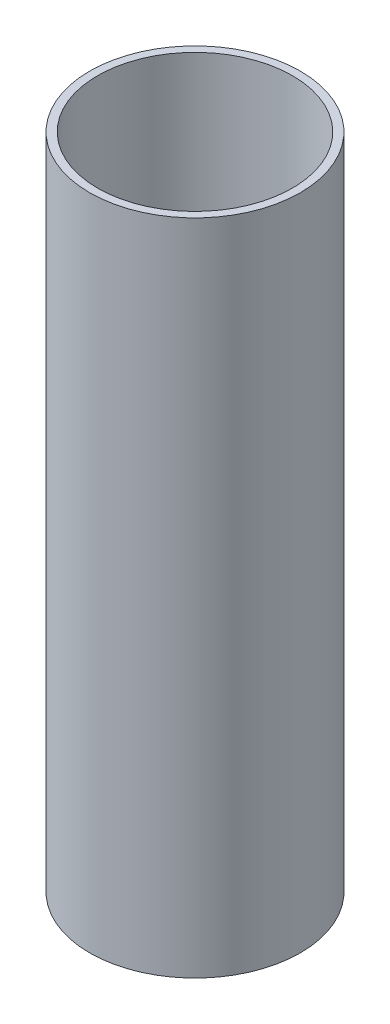
ISO-10303-21;
HEADER;
FILE_DESCRIPTION(('STEP AP214'),'2;1');
FILE_NAME('part.step','',(''),(''),'','','');
FILE_SCHEMA(('AUTOMOTIVE_DESIGN { 1 0 10303 214 1 1 1 1 }'));
ENDSEC;
DATA;
#1=APPLICATION_CONTEXT('core data for automotive mechanical design processes');
#2=APPLICATION_PROTOCOL_DEFINITION('international standard','automotive_design',2000,#1);
#3=PRODUCT_CONTEXT('',#1,'mechanical');
#4=PRODUCT('Part','Part','',(#3));
#5=PRODUCT_RELATED_PRODUCT_CATEGORY('part','',(#4));
#6=PRODUCT_DEFINITION_FORMATION('','',#4);
#7=PRODUCT_DEFINITION_CONTEXT('part definition',#1,'design');
#8=PRODUCT_DEFINITION('design','',#6,#7);
#9=PRODUCT_DEFINITION_SHAPE('','',#8);
#10=(LENGTH_UNIT() NAMED_UNIT(*) SI_UNIT(.MILLI.,.METRE.));
#11=(NAMED_UNIT(*) PLANE_ANGLE_UNIT() SI_UNIT($,.RADIAN.));
#12=(NAMED_UNIT(*) SI_UNIT($,.STERADIAN.) SOLID_ANGLE_UNIT());
#13=UNCERTAINTY_MEASURE_WITH_UNIT(LENGTH_MEASURE(1.E-05),#10,'distance_accuracy_value','');
#14=(GEOMETRIC_REPRESENTATION_CONTEXT(3) GLOBAL_UNCERTAINTY_ASSIGNED_CONTEXT((#13)) GLOBAL_UNIT_ASSIGNED_CONTEXT((#10,
#11,#12)) REPRESENTATION_CONTEXT('',''));
#15=CARTESIAN_POINT('',(0.,0.,0.));
#16=DIRECTION('',(0.,0.,1.));
#17=DIRECTION('',(1.,0.,0.));
#18=AXIS2_PLACEMENT_3D('',#15,#16,#17);
#19=CARTESIAN_POINT('',(0.,100.,0.));
#20=DIRECTION('',(0.,1.,0.));
#21=DIRECTION('',(0.,0.,1.));
#22=AXIS2_PLACEMENT_3D('',#19,#20,#21);
#23=PLANE('',#22);
#24=CARTESIAN_POINT('',(0.,100.,0.));
#25=DIRECTION('',(0.,1.,0.));
#26=DIRECTION('',(0.,0.,1.));
#27=AXIS2_PLACEMENT_3D('',#24,#25,#26);
#28=CIRCLE('',#27,16.);
#29=CARTESIAN_POINT('',(0.,100.,16.));
#30=VERTEX_POINT('',#29);
#31=EDGE_CURVE('E10',#30,#30,#28,.T.);
#32=ORIENTED_EDGE('',*,*,#31,.T.);
#33=EDGE_LOOP('',(#32));
#34=FACE_BOUND('',#33,.T.);
#35=CARTESIAN_POINT('',(0.,100.,0.));
#36=DIRECTION('',(0.,1.,0.));
#37=DIRECTION('',(0.,0.,1.));
#38=AXIS2_PLACEMENT_3D('',#35,#36,#37);
#39=CIRCLE('',#38,14.8);
#40=CARTESIAN_POINT('',(0.,100.,14.8));
#41=VERTEX_POINT('',#40);
#42=EDGE_CURVE('E50',#41,#41,#39,.T.);
#43=ORIENTED_EDGE('',*,*,#42,.F.);
#44=EDGE_LOOP('',(#43));
#45=FACE_BOUND('',#44,.T.);
#46=ADVANCED_FACE('F31',(#34,#45),#23,.T.);
#47=CARTESIAN_POINT('',(0.,0.,0.));
#48=DIRECTION('',(0.,1.,0.));
#49=DIRECTION('',(0.,0.,1.));
#50=AXIS2_PLACEMENT_3D('',#47,#48,#49);
#51=PLANE('',#50);
#52=CARTESIAN_POINT('',(0.,0.,0.));
#53=DIRECTION('',(0.,1.,0.));
#54=DIRECTION('',(0.,0.,1.));
#55=AXIS2_PLACEMENT_3D('',#52,#53,#54);
#56=CIRCLE('',#55,16.);
#57=CARTESIAN_POINT('',(0.,0.,16.));
#58=VERTEX_POINT('',#57);
#59=EDGE_CURVE('E45',#58,#58,#56,.T.);
#60=ORIENTED_EDGE('',*,*,#59,.F.);
#61=EDGE_LOOP('',(#60));
#62=FACE_BOUND('',#61,.T.);
#63=CARTESIAN_POINT('',(0.,0.,0.));
#64=DIRECTION('',(0.,1.,0.));
#65=DIRECTION('',(0.,0.,1.));
#66=AXIS2_PLACEMENT_3D('',#63,#64,#65);
#67=CIRCLE('',#66,14.8);
#68=CARTESIAN_POINT('',(0.,0.,14.8));
#69=VERTEX_POINT('',#68);
#70=EDGE_CURVE('E52',#69,#69,#67,.T.);
#71=ORIENTED_EDGE('',*,*,#70,.T.);
#72=EDGE_LOOP('',(#71));
#73=FACE_BOUND('',#72,.T.);
#74=ADVANCED_FACE('F73',(#62,#73),#51,.F.);
#75=CARTESIAN_POINT('',(0.,100.,0.));
#76=DIRECTION('',(0.,-1.,0.));
#77=DIRECTION('',(0.,0.,-1.));
#78=AXIS2_PLACEMENT_3D('',#75,#76,#77);
#79=CYLINDRICAL_SURFACE('',#78,16.);
#80=CARTESIAN_POINT('',(-16.,46.75,0.));
#81=CARTESIAN_POINT('',(-15.9999966646237,46.750006570971,-0.180565132631705));
#82=CARTESIAN_POINT('',(-15.9969120751067,46.765098730668,-0.361212725607512));
#83=CARTESIAN_POINT('',(-15.9849046283172,46.8250183064116,-0.717397707191656));
#84=CARTESIAN_POINT('',(-15.9759772079962,46.8698689631915,-0.892930989695779));
#85=CARTESIAN_POINT('',(-15.9532805125841,46.9878595819936,-1.23368637519508));
#86=CARTESIAN_POINT('',(-15.9395159445194,47.0609720493499,-1.39891831903528));
#87=CARTESIAN_POINT('',(-15.9086395561802,47.2333282741358,-1.71475976331505));
#88=CARTESIAN_POINT('',(-15.8915279168957,47.3325706187148,-1.86537005374944));
#89=CARTESIAN_POINT('',(-15.8555724279308,47.5558365386875,-2.14980411461516));
#90=CARTESIAN_POINT('',(-15.8367096038159,47.6801542958909,-2.28339459161106));
#91=CARTESIAN_POINT('',(-15.7995150373192,47.9494098537624,-2.52797636462918));
#92=CARTESIAN_POINT('',(-15.7811833374189,48.0943492983817,-2.638965857195));
#93=CARTESIAN_POINT('',(-15.7469410432691,48.4024195897507,-2.83619392044018));
#94=CARTESIAN_POINT('',(-15.7310548471879,48.5657087405843,-2.92218983148908));
#95=CARTESIAN_POINT('',(-15.7037722078902,48.9047948786277,-3.06543474436856));
#96=CARTESIAN_POINT('',(-15.6923753063412,49.0805905868215,-3.12268668096621));
#97=CARTESIAN_POINT('',(-15.675553844438,49.4371862248864,-3.206058900292));
#98=CARTESIAN_POINT('',(-15.6700507183424,49.6178865310743,-3.23258911090054));
#99=CARTESIAN_POINT('',(-15.6654034990304,49.981250782089,-3.25503827573114));
#100=CARTESIAN_POINT('',(-15.6662587346449,50.1639145176297,-3.25096046084144));
#101=CARTESIAN_POINT('',(-15.6741602660061,50.5230136425313,-3.21264051045314));
#102=CARTESIAN_POINT('',(-15.6811099023227,50.6995017299665,-3.17886930111174));
#103=CARTESIAN_POINT('',(-15.700264889166,51.0442539143407,-3.08286498368779));
#104=CARTESIAN_POINT('',(-15.7124704978078,51.2125176069365,-3.0206304777943));
#105=CARTESIAN_POINT('',(-15.7408604115287,51.5373963961191,-2.86901930509808));
#106=CARTESIAN_POINT('',(-15.7570717968577,51.6939223417758,-2.77945688307253));
#107=CARTESIAN_POINT('',(-15.791629391049,51.9898999444595,-2.5758632161681));
#108=CARTESIAN_POINT('',(-15.8099758525405,52.1293495769471,-2.46182907436555));
#109=CARTESIAN_POINT('',(-15.8471545211095,52.3899324825654,-2.21001217021903));
#110=CARTESIAN_POINT('',(-15.8659894217207,52.5106775230184,-2.07182771228543));
#111=CARTESIAN_POINT('',(-15.901711044887,52.7273366930505,-1.77696522476257));
#112=CARTESIAN_POINT('',(-15.9185977409231,52.8232504846486,-1.62028694349403));
#113=CARTESIAN_POINT('',(-15.9485638113746,52.987600185492,-1.29244623366484));
#114=CARTESIAN_POINT('',(-15.9616368822529,53.05599067151,-1.12126042147162));
#115=CARTESIAN_POINT('',(-15.9824550582656,53.1629328601267,-0.769504003338384));
#116=CARTESIAN_POINT('',(-15.9902008295171,53.2014882933283,-0.588934573748803));
#117=CARTESIAN_POINT('',(-15.99939857058,53.2471138665963,-0.226871865781589));
#118=CARTESIAN_POINT('',(-16.0009567024352,53.2547151490436,-0.0454481344398736));
#119=CARTESIAN_POINT('',(-15.9978989023387,53.2396485622938,0.316077004417125));
#120=CARTESIAN_POINT('',(-15.9932833289012,53.2169824507589,0.496178488106172));
#121=CARTESIAN_POINT('',(-15.9784632529827,53.1424656353785,0.848225746050423));
#122=CARTESIAN_POINT('',(-15.968311151576,53.0908884381921,1.02023181245312));
#123=CARTESIAN_POINT('',(-15.9435524875245,52.9603131707462,1.35315376283978));
#124=CARTESIAN_POINT('',(-15.9289455834055,52.8813129983678,1.51406879550253));
#125=CARTESIAN_POINT('',(-15.8966335517596,52.6969921106735,1.8224739025872));
#126=CARTESIAN_POINT('',(-15.8788917690498,52.5913528639048,1.96976968170935));
#127=CARTESIAN_POINT('',(-15.8423622519939,52.3571778930224,2.24473424512057));
#128=CARTESIAN_POINT('',(-15.8235744018777,52.2286396311562,2.37240085110833));
#129=CARTESIAN_POINT('',(-15.7867109690142,51.9498941591937,2.6065411315581));
#130=CARTESIAN_POINT('',(-15.768651249881,51.7993777535424,2.71264964116184));
#131=CARTESIAN_POINT('',(-15.7356296163404,51.4823463165393,2.89808000196379));
#132=CARTESIAN_POINT('',(-15.720667576021,51.315831935863,2.97740294200237));
#133=CARTESIAN_POINT('',(-15.6956644511249,50.9723811759098,3.10651699221108));
#134=CARTESIAN_POINT('',(-15.6855974943522,50.7955052520352,3.15646366659268));
#135=CARTESIAN_POINT('',(-15.6714707601945,50.4356443821258,3.22587685871587));
#136=CARTESIAN_POINT('',(-15.6674101714942,50.2526602645757,3.2453474930555));
#137=CARTESIAN_POINT('',(-15.66580196534,49.8894459579902,3.25309981483204));
#138=CARTESIAN_POINT('',(-15.6681337889354,49.7092283781657,3.24195881917534));
#139=CARTESIAN_POINT('',(-15.6787777750219,49.353293880371,3.19008094160757));
#140=CARTESIAN_POINT('',(-15.6870898860761,49.1775769237041,3.1493443142506));
#141=CARTESIAN_POINT('',(-15.7087031806699,48.8360136753423,3.03969259589678));
#142=CARTESIAN_POINT('',(-15.7219914440335,48.6701430993727,2.97085043723076));
#143=CARTESIAN_POINT('',(-15.7520667705198,48.352216817926,2.80700898812683));
#144=CARTESIAN_POINT('',(-15.7688541387279,48.2001623187272,2.71200741663012));
#145=CARTESIAN_POINT('',(-15.8044036374704,47.9113143201949,2.49658124373232));
#146=CARTESIAN_POINT('',(-15.8231952007298,47.7748346853167,2.37574058635476));
#147=CARTESIAN_POINT('',(-15.8604267420256,47.5238995884236,2.11292297558447));
#148=CARTESIAN_POINT('',(-15.878866638231,47.4094491974994,1.97094116884803));
#149=CARTESIAN_POINT('',(-15.9135534759073,47.2046452604325,1.6680182265055));
#150=CARTESIAN_POINT('',(-15.9297744359667,47.1145668133304,1.50688799217041));
#151=CARTESIAN_POINT('',(-15.9579393213573,46.962909353977,1.17149053549585));
#152=CARTESIAN_POINT('',(-15.9698870569036,46.9013049384907,0.997235184857632));
#153=CARTESIAN_POINT('',(-15.985868429305,46.8201233246263,0.685518178854148));
#154=CARTESIAN_POINT('',(-15.991136468014,46.79387448043,0.549817676804576));
#155=CARTESIAN_POINT('',(-15.9982034701292,46.7588105995681,0.27609413593502));
#156=CARTESIAN_POINT('',(-16.0000025504333,46.7499949754325,0.138071175536014));
#157=CARTESIAN_POINT('',(-16.,46.75,0.));
#158=B_SPLINE_CURVE_WITH_KNOTS('',3,(#80,#81,#82,#83,#84,#85,#86,#87,#88,#89,#90,#91,#92,#93,
#94,#95,#96,#97,#98,#99,#100,#101,#102,#103,#104,#105,#106,#107,#108,#109,#110,#111,#112,#113,
#114,#115,#116,#117,#118,#119,#120,#121,#122,#123,#124,#125,#126,#127,#128,#129,#130,#131,#132,
#133,#134,#135,#136,#137,#138,#139,#140,#141,#142,#143,#144,#145,#146,#147,#148,#149,#150,#151,
#152,#153,#154,#155,#156,#157),.UNSPECIFIED.,.T.,.F.,(4,2,2,2,2,2,2,2,2,2,2,2,2,2,2,2,2,2,2,2,2,
2,2,2,2,2,2,2,2,2,2,2,2,2,2,2,2,2,4),(0.,0.541190246355875,1.08280364869612,1.62389146005099,
2.16495002062773,2.71276994601618,3.26063356784356,3.81365106656645,4.36661209057429,
4.91210655735456,5.45754344424045,5.99448285283523,6.53144863294963,7.07214884459611,
7.61291309882538,8.1637195613689,8.71453352060781,9.26625282693039,9.81790313460537,
10.3600467359334,10.9021588557314,11.439226960504,11.976336243536,12.5202006243126,
13.0641253156663,13.6166104975637,14.1690732180903,14.7185833574271,15.2680192644282,
15.8071646250623,16.3463053485242,16.8840558346119,17.4218532265357,17.9690680888234,
18.5164087686878,19.0696916961129,19.6224800523617,20.0363212551017,20.4501485118589),.UNSPECIFIED.);
#159=CARTESIAN_POINT('',(-16.,46.75,0.));
#160=VERTEX_POINT('',#159);
#161=EDGE_CURVE('E55',#160,#160,#158,.T.);
#162=ORIENTED_EDGE('',*,*,#161,.T.);
#163=EDGE_LOOP('',(#162));
#164=FACE_BOUND('',#163,.T.);
#165=ORIENTED_EDGE('',*,*,#31,.F.);
#166=EDGE_LOOP('',(#165));
#167=FACE_BOUND('',#166,.T.);
#168=ORIENTED_EDGE('',*,*,#59,.T.);
#169=EDGE_LOOP('',(#168));
#170=FACE_BOUND('',#169,.T.);
#171=ADVANCED_FACE('F33',(#164,#167,#170),#79,.T.);
#172=CARTESIAN_POINT('',(0.,100.,0.));
#173=DIRECTION('',(0.,-1.,0.));
#174=DIRECTION('',(0.,0.,-1.));
#175=AXIS2_PLACEMENT_3D('',#172,#173,#174);
#176=CYLINDRICAL_SURFACE('',#175,14.8);
#177=CARTESIAN_POINT('',(-14.4387499458921,50.,-3.25));
#178=CARTESIAN_POINT('',(-14.4387535874129,50.1801765006842,-3.2499938277359));
#179=CARTESIAN_POINT('',(-14.4421592276831,50.3604270268599,-3.23496585250089));
#180=CARTESIAN_POINT('',(-14.4553885259569,50.7158007738517,-3.1753175871527));
#181=CARTESIAN_POINT('',(-14.4652168001522,50.8909202120991,-3.13067601226789));
#182=CARTESIAN_POINT('',(-14.4901258054567,51.2308397640937,-3.01327504956416));
#183=CARTESIAN_POINT('',(-14.5052007452688,51.3956510204098,-2.94054665446309));
#184=CARTESIAN_POINT('',(-14.5388975392124,51.7107367777164,-2.76912538929746));
#185=CARTESIAN_POINT('',(-14.5575193262179,51.8610115537361,-2.67043301060126));
#186=CARTESIAN_POINT('',(-14.5965658453034,52.1453194019104,-2.44809409197536));
#187=CARTESIAN_POINT('',(-14.6170137954329,52.2790689305882,-2.32408899565423));
#188=CARTESIAN_POINT('',(-14.6572054531687,52.5240459555042,-2.05541866976947));
#189=CARTESIAN_POINT('',(-14.6769491056636,52.6352716924206,-1.91075182783128));
#190=CARTESIAN_POINT('',(-14.7137605450744,52.8331664276518,-1.60296245957637));
#191=CARTESIAN_POINT('',(-14.7307977416852,52.9195625599533,-1.43966051931616));
#192=CARTESIAN_POINT('',(-14.7600143068375,53.0635800312741,-1.10041915174859));
#193=CARTESIAN_POINT('',(-14.7721942248682,53.1212046253159,-0.924481156578522));
#194=CARTESIAN_POINT('',(-14.7901598119589,53.2051510595196,-0.567910298041369));
#195=CARTESIAN_POINT('',(-14.7960434135623,53.2319528230752,-0.387395439217596));
#196=CARTESIAN_POINT('',(-14.8010928026582,53.2549934692331,-0.0243421015741572));
#197=CARTESIAN_POINT('',(-14.800259364538,53.2512358749301,0.158196141552684));
#198=CARTESIAN_POINT('',(-14.7920433743601,53.2136215866136,0.516805679326181));
#199=CARTESIAN_POINT('',(-14.7847733872483,53.1802822088824,0.692934193613359));
#200=CARTESIAN_POINT('',(-14.7646294946643,53.0852752820796,1.03703381994057));
#201=CARTESIAN_POINT('',(-14.7517553344933,53.0236064454825,1.20500456084006));
#202=CARTESIAN_POINT('',(-14.7216688689991,52.8732345921745,1.52945471918847));
#203=CARTESIAN_POINT('',(-14.7044253091823,52.7843357987889,1.68584038371796));
#204=CARTESIAN_POINT('',(-14.6674902411786,52.5821735959499,1.98166243410797));
#205=CARTESIAN_POINT('',(-14.6477983971939,52.4689068427145,2.12109648974765));
#206=CARTESIAN_POINT('',(-14.6076442003422,52.2184086701278,2.38213426082619));
#207=CARTESIAN_POINT('',(-14.5871743492521,52.0807245062017,2.5033027424754));
#208=CARTESIAN_POINT('',(-14.5481578452735,51.7867788316692,2.72091183309122));
#209=CARTESIAN_POINT('',(-14.5296112453659,51.6305168095415,2.81735176095281));
#210=CARTESIAN_POINT('',(-14.4965211712521,51.3031435411029,2.98296178302207));
#211=CARTESIAN_POINT('',(-14.4819898973007,51.1319890724769,3.05204903760731));
#212=CARTESIAN_POINT('',(-14.45874443103,50.7801049078469,3.1603495824434));
#213=CARTESIAN_POINT('',(-14.4500293078492,50.5993767490899,3.19956765332945));
#214=CARTESIAN_POINT('',(-14.4395928995883,50.2374538841642,3.24634025121854));
#215=CARTESIAN_POINT('',(-14.4377316009195,50.056345052565,3.25452876916592));
#216=CARTESIAN_POINT('',(-14.4408358033694,49.6953500452184,3.24072678208942));
#217=CARTESIAN_POINT('',(-14.4458008314774,49.5154637856243,3.21873836808979));
#218=CARTESIAN_POINT('',(-14.4618659831257,49.1642315898221,3.14575691001596));
#219=CARTESIAN_POINT('',(-14.4728920903436,48.9928092897632,3.09511357780945));
#220=CARTESIAN_POINT('',(-14.4997701744014,48.6608832552429,2.96663875366801));
#221=CARTESIAN_POINT('',(-14.5156226161595,48.5003805744859,2.88880464235304));
#222=CARTESIAN_POINT('',(-14.5506744799528,48.1921077546084,2.70676272520244));
#223=CARTESIAN_POINT('',(-14.5699219902229,48.044573645943,2.60216467075977));
#224=CARTESIAN_POINT('',(-14.6094686917118,47.7689193890099,2.37007420458765));
#225=CARTESIAN_POINT('',(-14.6297680143966,47.6408016754902,2.24257892599903));
#226=CARTESIAN_POINT('',(-14.6695929949434,47.4051533695213,1.9654431519516));
#227=CARTESIAN_POINT('',(-14.6890969281212,47.2980551827056,1.81543132972475));
#228=CARTESIAN_POINT('',(-14.7247325730122,47.1105795180029,1.49917786148334));
#229=CARTESIAN_POINT('',(-14.7408644428634,47.0302007869622,1.33293697709181));
#230=CARTESIAN_POINT('',(-14.7678467955781,46.8990464723496,0.989984167149772));
#231=CARTESIAN_POINT('',(-14.7787308086578,46.8480825244158,0.813347035171695));
#232=CARTESIAN_POINT('',(-14.7941361408791,46.7766167292433,0.453752170470014));
#233=CARTESIAN_POINT('',(-14.7986583927242,46.7561104165589,0.270795368309486));
#234=CARTESIAN_POINT('',(-14.8008027015257,46.7463440975691,-0.09214160546584));
#235=CARTESIAN_POINT('',(-14.7985672850754,46.7564386972376,-0.272103870588242));
#236=CARTESIAN_POINT('',(-14.7877530780885,46.8061431377838,-0.627700202113454));
#237=CARTESIAN_POINT('',(-14.7791744033451,46.8457524398844,-0.803334347463582));
#238=CARTESIAN_POINT('',(-14.7566484410211,46.9530516059647,-1.14478501189272));
#239=CARTESIAN_POINT('',(-14.7427187922413,47.0206492662983,-1.31063174331646));
#240=CARTESIAN_POINT('',(-14.7109777826035,47.1819166538671,-1.62871479828574));
#241=CARTESIAN_POINT('',(-14.6931660417686,47.2755889335199,-1.78094978746333));
#242=CARTESIAN_POINT('',(-14.6551782443242,47.4884474290367,-2.07063382987526));
#243=CARTESIAN_POINT('',(-14.6349635036729,47.6080870948046,-2.20774464716579));
#244=CARTESIAN_POINT('',(-14.5946554937188,47.8685704778411,-2.46016423014551));
#245=CARTESIAN_POINT('',(-14.574562254904,48.0094193046546,-2.57546772704376));
#246=CARTESIAN_POINT('',(-14.5364697193474,48.3106097926405,-2.782500193115));
#247=CARTESIAN_POINT('',(-14.5185023556843,48.4711889544445,-2.87388986307178));
#248=CARTESIAN_POINT('',(-14.48709809691,48.8057873986004,-3.0282404554808));
#249=CARTESIAN_POINT('',(-14.473657383641,48.9797952010413,-3.09122535219194));
#250=CARTESIAN_POINT('',(-14.4553033460392,49.2949738692561,-3.17578168304933));
#251=CARTESIAN_POINT('',(-14.4491371594593,49.4344397990343,-3.20355999337499));
#252=CARTESIAN_POINT('',(-14.4408591241463,49.7159218971353,-3.24067112855683));
#253=CARTESIAN_POINT('',(-14.4387470746967,49.8579379388531,-3.25000486658669));
#254=CARTESIAN_POINT('',(-14.4387499458921,50.,-3.25));
#255=B_SPLINE_CURVE_WITH_KNOTS('',3,(#177,#178,#179,#180,#181,#182,#183,#184,#185,#186,#187,
#188,#189,#190,#191,#192,#193,#194,#195,#196,#197,#198,#199,#200,#201,#202,#203,#204,#205,#206,
#207,#208,#209,#210,#211,#212,#213,#214,#215,#216,#217,#218,#219,#220,#221,#222,#223,#224,#225,
#226,#227,#228,#229,#230,#231,#232,#233,#234,#235,#236,#237,#238,#239,#240,#241,#242,#243,#244,
#245,#246,#247,#248,#249,#250,#251,#252,#253,#254),.UNSPECIFIED.,.T.,.F.,(4,2,2,2,2,2,2,2,2,2,2,
2,2,2,2,2,2,2,2,2,2,2,2,2,2,2,2,2,2,2,2,2,2,2,2,2,2,2,4),(0.,0.540008828465256,1.08040620936664,
1.62020897872464,2.16000153305086,2.70804948354793,3.25614022529339,3.81004209857549,
4.36388129284013,4.90897498845928,5.45400584278361,5.98968921007481,6.52539692566808,
7.06505043728156,7.60477804766672,8.15582412667056,8.70688538165073,9.25960302916996,
9.81223219428978,10.3535072757007,10.8947448528953,11.4295152543479,11.9643371862609,
12.5074523399313,13.0506355420924,13.6040324236583,14.1574033470159,14.7071901491651,
15.2568963381782,15.7950900867372,16.3332740110645,16.8696988968139,17.4061763111207,
17.9529079357883,18.4997714861098,19.054018289209,19.6077964161691,20.0335931503615,
20.4593688032241),.UNSPECIFIED.);
#256=CARTESIAN_POINT('',(-14.4387499458921,50.,-3.25));
#257=VERTEX_POINT('',#256);
#258=EDGE_CURVE('E36',#257,#257,#255,.T.);
#259=ORIENTED_EDGE('',*,*,#258,.F.);
#260=EDGE_LOOP('',(#259));
#261=FACE_BOUND('',#260,.T.);
#262=ORIENTED_EDGE('',*,*,#42,.T.);
#263=EDGE_LOOP('',(#262));
#264=FACE_BOUND('',#263,.T.);
#265=ORIENTED_EDGE('',*,*,#70,.F.);
#266=EDGE_LOOP('',(#265));
#267=FACE_BOUND('',#266,.T.);
#268=ADVANCED_FACE('F65',(#261,#264,#267),#176,.F.);
#269=CARTESIAN_POINT('',(-16.,50.,0.));
#270=DIRECTION('',(1.,0.,0.));
#271=DIRECTION('',(0.,0.,-1.));
#272=AXIS2_PLACEMENT_3D('',#269,#270,#271);
#273=CYLINDRICAL_SURFACE('',#272,3.25);
#274=ORIENTED_EDGE('',*,*,#258,.T.);
#275=EDGE_LOOP('',(#274));
#276=FACE_BOUND('',#275,.T.);
#277=ORIENTED_EDGE('',*,*,#161,.F.);
#278=EDGE_LOOP('',(#277));
#279=FACE_BOUND('',#278,.T.);
#280=ADVANCED_FACE('F62',(#276,#279),#273,.F.);
#281=CLOSED_SHELL('',(#46,#74,#171,#268,#280));
#282=MANIFOLD_SOLID_BREP('B2',#281);
#283=ADVANCED_BREP_SHAPE_REPRESENTATION('',(#18,#282),#14);
#284=SHAPE_DEFINITION_REPRESENTATION(#9,#283);
ENDSEC;
END-ISO-10303-21;
